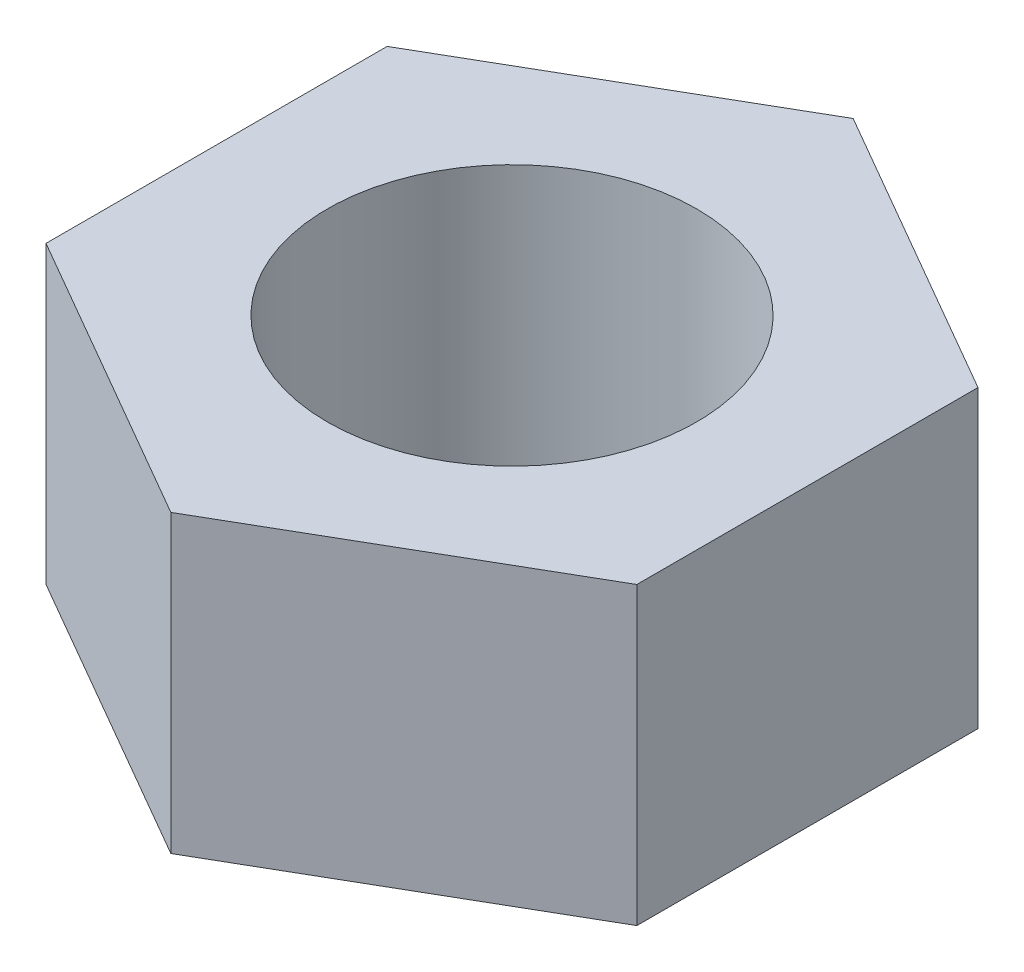
ISO-10303-21;
HEADER;
FILE_DESCRIPTION(('STEP AP214'),'2;1');
FILE_NAME('part.step','',(''),(''),'','','');
FILE_SCHEMA(('AUTOMOTIVE_DESIGN { 1 0 10303 214 1 1 1 1 }'));
ENDSEC;
DATA;
#1=APPLICATION_CONTEXT('core data for automotive mechanical design processes');
#2=APPLICATION_PROTOCOL_DEFINITION('international standard','automotive_design',2000,#1);
#3=PRODUCT_CONTEXT('',#1,'mechanical');
#4=PRODUCT('Part','Part','',(#3));
#5=PRODUCT_RELATED_PRODUCT_CATEGORY('part','',(#4));
#6=PRODUCT_DEFINITION_FORMATION('','',#4);
#7=PRODUCT_DEFINITION_CONTEXT('part definition',#1,'design');
#8=PRODUCT_DEFINITION('design','',#6,#7);
#9=PRODUCT_DEFINITION_SHAPE('','',#8);
#10=(LENGTH_UNIT() NAMED_UNIT(*) SI_UNIT(.MILLI.,.METRE.));
#11=(NAMED_UNIT(*) PLANE_ANGLE_UNIT() SI_UNIT($,.RADIAN.));
#12=(NAMED_UNIT(*) SI_UNIT($,.STERADIAN.) SOLID_ANGLE_UNIT());
#13=UNCERTAINTY_MEASURE_WITH_UNIT(LENGTH_MEASURE(1.E-05),#10,'distance_accuracy_value','');
#14=(GEOMETRIC_REPRESENTATION_CONTEXT(3) GLOBAL_UNCERTAINTY_ASSIGNED_CONTEXT((#13)) GLOBAL_UNIT_ASSIGNED_CONTEXT((#10,
#11,#12)) REPRESENTATION_CONTEXT('',''));
#15=CARTESIAN_POINT('',(0.,0.,0.));
#16=DIRECTION('',(0.,0.,1.));
#17=DIRECTION('',(1.,0.,0.));
#18=AXIS2_PLACEMENT_3D('',#15,#16,#17);
#19=CARTESIAN_POINT('',(0.,4.,4.61880215351701));
#20=DIRECTION('',(0.,1.,0.));
#21=DIRECTION('',(0.,0.,1.));
#22=AXIS2_PLACEMENT_3D('',#19,#20,#21);
#23=PLANE('',#22);
#24=DIRECTION('',(0.866025403784439,0.,0.5));
#25=VECTOR('',#24,1.);
#26=CARTESIAN_POINT('',(-4.,4.,2.3094010767585));
#27=LINE('',#26,#25);
#28=CARTESIAN_POINT('',(-4.,4.,2.3094010767585));
#29=VERTEX_POINT('',#28);
#30=CARTESIAN_POINT('',(0.,4.,4.61880215351701));
#31=VERTEX_POINT('',#30);
#32=EDGE_CURVE('E127',#29,#31,#27,.T.);
#33=ORIENTED_EDGE('',*,*,#32,.T.);
#34=DIRECTION('',(0.866025403784439,0.,-0.5));
#35=VECTOR('',#34,1.);
#36=CARTESIAN_POINT('',(0.,4.,4.61880215351701));
#37=LINE('',#36,#35);
#38=CARTESIAN_POINT('',(4.,4.,2.3094010767585));
#39=VERTEX_POINT('',#38);
#40=EDGE_CURVE('E85',#31,#39,#37,.T.);
#41=ORIENTED_EDGE('',*,*,#40,.T.);
#42=DIRECTION('',(0.,0.,-1.));
#43=VECTOR('',#42,1.);
#44=CARTESIAN_POINT('',(4.,4.,2.3094010767585));
#45=LINE('',#44,#43);
#46=CARTESIAN_POINT('',(4.,4.,-2.30940107675851));
#47=VERTEX_POINT('',#46);
#48=EDGE_CURVE('E98',#39,#47,#45,.T.);
#49=ORIENTED_EDGE('',*,*,#48,.T.);
#50=DIRECTION('',(-0.866025403784439,0.,-0.5));
#51=VECTOR('',#50,1.);
#52=CARTESIAN_POINT('',(4.,4.,-2.30940107675851));
#53=LINE('',#52,#51);
#54=CARTESIAN_POINT('',(0.,4.,-4.61880215351701));
#55=VERTEX_POINT('',#54);
#56=EDGE_CURVE('E92',#47,#55,#53,.T.);
#57=ORIENTED_EDGE('',*,*,#56,.T.);
#58=DIRECTION('',(-0.866025403784439,0.,0.5));
#59=VECTOR('',#58,1.);
#60=CARTESIAN_POINT('',(0.,4.,-4.61880215351701));
#61=LINE('',#60,#59);
#62=CARTESIAN_POINT('',(-4.,4.,-2.3094010767585));
#63=VERTEX_POINT('',#62);
#64=EDGE_CURVE('E96',#55,#63,#61,.T.);
#65=ORIENTED_EDGE('',*,*,#64,.T.);
#66=DIRECTION('',(0.,0.,1.));
#67=VECTOR('',#66,1.);
#68=CARTESIAN_POINT('',(-4.,4.,-2.3094010767585));
#69=LINE('',#68,#67);
#70=EDGE_CURVE('E48',#63,#29,#69,.T.);
#71=ORIENTED_EDGE('',*,*,#70,.T.);
#72=EDGE_LOOP('',(#33,#41,#49,#57,#65,#71));
#73=FACE_BOUND('',#72,.T.);
#74=CARTESIAN_POINT('',(0.,4.,0.));
#75=DIRECTION('',(0.,1.,0.));
#76=DIRECTION('',(0.,0.,1.));
#77=AXIS2_PLACEMENT_3D('',#74,#75,#76);
#78=CIRCLE('',#77,2.5);
#79=CARTESIAN_POINT('',(0.,4.,2.5));
#80=VERTEX_POINT('',#79);
#81=EDGE_CURVE('E120',#80,#80,#78,.T.);
#82=ORIENTED_EDGE('',*,*,#81,.F.);
#83=EDGE_LOOP('',(#82));
#84=FACE_BOUND('',#83,.T.);
#85=ADVANCED_FACE('F31',(#73,#84),#23,.T.);
#86=CARTESIAN_POINT('',(0.,0.,4.61880215351701));
#87=DIRECTION('',(0.,1.,0.));
#88=DIRECTION('',(0.,0.,1.));
#89=AXIS2_PLACEMENT_3D('',#86,#87,#88);
#90=PLANE('',#89);
#91=DIRECTION('',(0.866025403784439,0.,0.5));
#92=VECTOR('',#91,1.);
#93=CARTESIAN_POINT('',(-4.,0.,2.3094010767585));
#94=LINE('',#93,#92);
#95=CARTESIAN_POINT('',(-4.,0.,2.3094010767585));
#96=VERTEX_POINT('',#95);
#97=CARTESIAN_POINT('',(0.,0.,4.61880215351701));
#98=VERTEX_POINT('',#97);
#99=EDGE_CURVE('E116',#96,#98,#94,.T.);
#100=ORIENTED_EDGE('',*,*,#99,.F.);
#101=DIRECTION('',(0.,0.,1.));
#102=VECTOR('',#101,1.);
#103=CARTESIAN_POINT('',(-4.,0.,-2.3094010767585));
#104=LINE('',#103,#102);
#105=CARTESIAN_POINT('',(-4.,0.,-2.3094010767585));
#106=VERTEX_POINT('',#105);
#107=EDGE_CURVE('E77',#106,#96,#104,.T.);
#108=ORIENTED_EDGE('',*,*,#107,.F.);
#109=DIRECTION('',(-0.866025403784439,0.,0.5));
#110=VECTOR('',#109,1.);
#111=CARTESIAN_POINT('',(0.,0.,-4.61880215351701));
#112=LINE('',#111,#110);
#113=CARTESIAN_POINT('',(0.,0.,-4.61880215351701));
#114=VERTEX_POINT('',#113);
#115=EDGE_CURVE('E71',#114,#106,#112,.T.);
#116=ORIENTED_EDGE('',*,*,#115,.F.);
#117=DIRECTION('',(-0.866025403784439,0.,-0.5));
#118=VECTOR('',#117,1.);
#119=CARTESIAN_POINT('',(4.,0.,-2.30940107675851));
#120=LINE('',#119,#118);
#121=CARTESIAN_POINT('',(4.,0.,-2.30940107675851));
#122=VERTEX_POINT('',#121);
#123=EDGE_CURVE('E106',#122,#114,#120,.T.);
#124=ORIENTED_EDGE('',*,*,#123,.F.);
#125=DIRECTION('',(0.,0.,-1.));
#126=VECTOR('',#125,1.);
#127=CARTESIAN_POINT('',(4.,0.,2.3094010767585));
#128=LINE('',#127,#126);
#129=CARTESIAN_POINT('',(4.,0.,2.3094010767585));
#130=VERTEX_POINT('',#129);
#131=EDGE_CURVE('E122',#130,#122,#128,.T.);
#132=ORIENTED_EDGE('',*,*,#131,.F.);
#133=DIRECTION('',(0.866025403784439,0.,-0.5));
#134=VECTOR('',#133,1.);
#135=CARTESIAN_POINT('',(0.,0.,4.61880215351701));
#136=LINE('',#135,#134);
#137=EDGE_CURVE('E119',#98,#130,#136,.T.);
#138=ORIENTED_EDGE('',*,*,#137,.F.);
#139=EDGE_LOOP('',(#100,#108,#116,#124,#132,#138));
#140=FACE_BOUND('',#139,.T.);
#141=CARTESIAN_POINT('',(0.,0.,0.));
#142=DIRECTION('',(0.,1.,0.));
#143=DIRECTION('',(0.,0.,1.));
#144=AXIS2_PLACEMENT_3D('',#141,#142,#143);
#145=CIRCLE('',#144,2.5);
#146=CARTESIAN_POINT('',(0.,0.,2.5));
#147=VERTEX_POINT('',#146);
#148=EDGE_CURVE('E220',#147,#147,#145,.T.);
#149=ORIENTED_EDGE('',*,*,#148,.T.);
#150=EDGE_LOOP('',(#149));
#151=FACE_BOUND('',#150,.T.);
#152=ADVANCED_FACE('F136',(#140,#151),#90,.F.);
#153=CARTESIAN_POINT('',(-4.,4.,2.3094010767585));
#154=DIRECTION('',(0.5,0.,-0.866025403784439));
#155=DIRECTION('',(-0.866025403784439,0.,-0.5));
#156=AXIS2_PLACEMENT_3D('',#153,#154,#155);
#157=PLANE('',#156);
#158=ORIENTED_EDGE('',*,*,#99,.T.);
#159=DIRECTION('',(0.,-1.,0.));
#160=VECTOR('',#159,1.);
#161=CARTESIAN_POINT('',(0.,4.,4.61880215351701));
#162=LINE('',#161,#160);
#163=EDGE_CURVE('E11',#31,#98,#162,.T.);
#164=ORIENTED_EDGE('',*,*,#163,.F.);
#165=ORIENTED_EDGE('',*,*,#32,.F.);
#166=DIRECTION('',(0.,-1.,0.));
#167=VECTOR('',#166,1.);
#168=CARTESIAN_POINT('',(-4.,4.,2.3094010767585));
#169=LINE('',#168,#167);
#170=EDGE_CURVE('E112',#29,#96,#169,.T.);
#171=ORIENTED_EDGE('',*,*,#170,.T.);
#172=EDGE_LOOP('',(#158,#164,#165,#171));
#173=FACE_BOUND('',#172,.T.);
#174=ADVANCED_FACE('F33',(#173),#157,.F.);
#175=CARTESIAN_POINT('',(0.,4.,4.61880215351701));
#176=DIRECTION('',(-0.5,0.,-0.866025403784439));
#177=DIRECTION('',(-0.866025403784439,0.,0.5));
#178=AXIS2_PLACEMENT_3D('',#175,#176,#177);
#179=PLANE('',#178);
#180=ORIENTED_EDGE('',*,*,#137,.T.);
#181=DIRECTION('',(0.,-1.,0.));
#182=VECTOR('',#181,1.);
#183=CARTESIAN_POINT('',(4.,4.,2.3094010767585));
#184=LINE('',#183,#182);
#185=EDGE_CURVE('E40',#39,#130,#184,.T.);
#186=ORIENTED_EDGE('',*,*,#185,.F.);
#187=ORIENTED_EDGE('',*,*,#40,.F.);
#188=ORIENTED_EDGE('',*,*,#163,.T.);
#189=EDGE_LOOP('',(#180,#186,#187,#188));
#190=FACE_BOUND('',#189,.T.);
#191=ADVANCED_FACE('F161',(#190),#179,.F.);
#192=CARTESIAN_POINT('',(4.,4.,2.3094010767585));
#193=DIRECTION('',(-1.,0.,0.));
#194=DIRECTION('',(0.,0.,1.));
#195=AXIS2_PLACEMENT_3D('',#192,#193,#194);
#196=PLANE('',#195);
#197=ORIENTED_EDGE('',*,*,#131,.T.);
#198=DIRECTION('',(0.,-1.,0.));
#199=VECTOR('',#198,1.);
#200=CARTESIAN_POINT('',(4.,4.,-2.30940107675851));
#201=LINE('',#200,#199);
#202=EDGE_CURVE('E107',#47,#122,#201,.T.);
#203=ORIENTED_EDGE('',*,*,#202,.F.);
#204=ORIENTED_EDGE('',*,*,#48,.F.);
#205=ORIENTED_EDGE('',*,*,#185,.T.);
#206=EDGE_LOOP('',(#197,#203,#204,#205));
#207=FACE_BOUND('',#206,.T.);
#208=ADVANCED_FACE('F133',(#207),#196,.F.);
#209=CARTESIAN_POINT('',(4.,4.,-2.30940107675851));
#210=DIRECTION('',(-0.5,0.,0.866025403784439));
#211=DIRECTION('',(0.866025403784439,0.,0.5));
#212=AXIS2_PLACEMENT_3D('',#209,#210,#211);
#213=PLANE('',#212);
#214=ORIENTED_EDGE('',*,*,#123,.T.);
#215=DIRECTION('',(0.,-1.,0.));
#216=VECTOR('',#215,1.);
#217=CARTESIAN_POINT('',(0.,4.,-4.61880215351701));
#218=LINE('',#217,#216);
#219=EDGE_CURVE('E103',#55,#114,#218,.T.);
#220=ORIENTED_EDGE('',*,*,#219,.F.);
#221=ORIENTED_EDGE('',*,*,#56,.F.);
#222=ORIENTED_EDGE('',*,*,#202,.T.);
#223=EDGE_LOOP('',(#214,#220,#221,#222));
#224=FACE_BOUND('',#223,.T.);
#225=ADVANCED_FACE('F104',(#224),#213,.F.);
#226=CARTESIAN_POINT('',(0.,4.,-4.61880215351701));
#227=DIRECTION('',(0.5,0.,0.866025403784439));
#228=DIRECTION('',(0.866025403784439,0.,-0.5));
#229=AXIS2_PLACEMENT_3D('',#226,#227,#228);
#230=PLANE('',#229);
#231=ORIENTED_EDGE('',*,*,#115,.T.);
#232=DIRECTION('',(0.,-1.,0.));
#233=VECTOR('',#232,1.);
#234=CARTESIAN_POINT('',(-4.,4.,-2.3094010767585));
#235=LINE('',#234,#233);
#236=EDGE_CURVE('E108',#63,#106,#235,.T.);
#237=ORIENTED_EDGE('',*,*,#236,.F.);
#238=ORIENTED_EDGE('',*,*,#64,.F.);
#239=ORIENTED_EDGE('',*,*,#219,.T.);
#240=EDGE_LOOP('',(#231,#237,#238,#239));
#241=FACE_BOUND('',#240,.T.);
#242=ADVANCED_FACE('F110',(#241),#230,.F.);
#243=CARTESIAN_POINT('',(-4.,4.,-2.3094010767585));
#244=DIRECTION('',(1.,0.,0.));
#245=DIRECTION('',(0.,0.,-1.));
#246=AXIS2_PLACEMENT_3D('',#243,#244,#245);
#247=PLANE('',#246);
#248=ORIENTED_EDGE('',*,*,#107,.T.);
#249=ORIENTED_EDGE('',*,*,#170,.F.);
#250=ORIENTED_EDGE('',*,*,#70,.F.);
#251=ORIENTED_EDGE('',*,*,#236,.T.);
#252=EDGE_LOOP('',(#248,#249,#250,#251));
#253=FACE_BOUND('',#252,.T.);
#254=ADVANCED_FACE('F141',(#253),#247,.F.);
#255=CARTESIAN_POINT('',(0.,4.,0.));
#256=DIRECTION('',(0.,-1.,0.));
#257=DIRECTION('',(0.,0.,-1.));
#258=AXIS2_PLACEMENT_3D('',#255,#256,#257);
#259=CYLINDRICAL_SURFACE('',#258,2.5);
#260=ORIENTED_EDGE('',*,*,#81,.T.);
#261=EDGE_LOOP('',(#260));
#262=FACE_BOUND('',#261,.T.);
#263=ORIENTED_EDGE('',*,*,#148,.F.);
#264=EDGE_LOOP('',(#263));
#265=FACE_BOUND('',#264,.T.);
#266=ADVANCED_FACE('F143',(#262,#265),#259,.F.);
#267=CLOSED_SHELL('',(#85,#152,#174,#191,#208,#225,#242,#254,#266));
#268=MANIFOLD_SOLID_BREP('B2',#267);
#269=ADVANCED_BREP_SHAPE_REPRESENTATION('',(#18,#268),#14);
#270=SHAPE_DEFINITION_REPRESENTATION(#9,#269);
ENDSEC;
END-ISO-10303-21;
